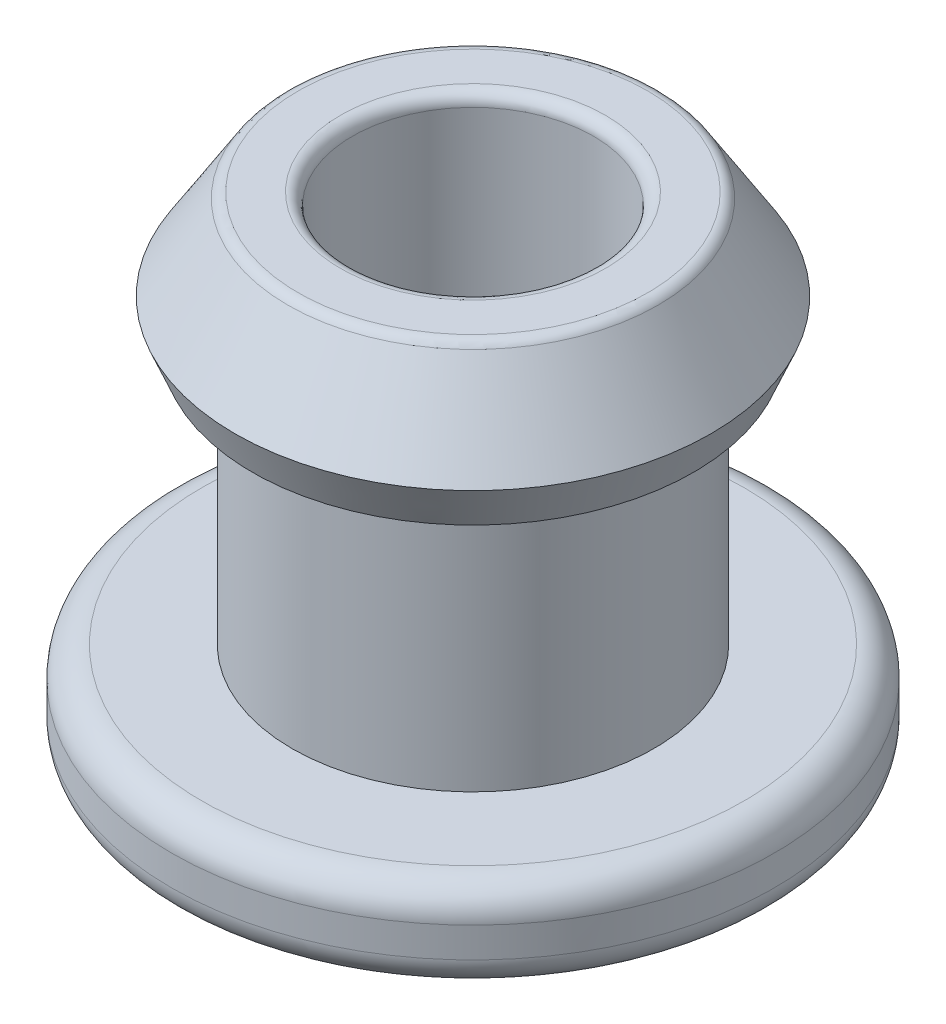
ISO-10303-21;
HEADER;
FILE_DESCRIPTION(('STEP AP214'),'2;1');
FILE_NAME('part.step','',(''),(''),'','','');
FILE_SCHEMA(('AUTOMOTIVE_DESIGN { 1 0 10303 214 1 1 1 1 }'));
ENDSEC;
DATA;
#1=APPLICATION_CONTEXT('core data for automotive mechanical design processes');
#2=APPLICATION_PROTOCOL_DEFINITION('international standard','automotive_design',2000,#1);
#3=PRODUCT_CONTEXT('',#1,'mechanical');
#4=PRODUCT('Part','Part','',(#3));
#5=PRODUCT_RELATED_PRODUCT_CATEGORY('part','',(#4));
#6=PRODUCT_DEFINITION_FORMATION('','',#4);
#7=PRODUCT_DEFINITION_CONTEXT('part definition',#1,'design');
#8=PRODUCT_DEFINITION('design','',#6,#7);
#9=PRODUCT_DEFINITION_SHAPE('','',#8);
#10=(LENGTH_UNIT() NAMED_UNIT(*) SI_UNIT(.MILLI.,.METRE.));
#11=(NAMED_UNIT(*) PLANE_ANGLE_UNIT() SI_UNIT($,.RADIAN.));
#12=(NAMED_UNIT(*) SI_UNIT($,.STERADIAN.) SOLID_ANGLE_UNIT());
#13=UNCERTAINTY_MEASURE_WITH_UNIT(LENGTH_MEASURE(1.E-05),#10,'distance_accuracy_value','');
#14=(GEOMETRIC_REPRESENTATION_CONTEXT(3) GLOBAL_UNCERTAINTY_ASSIGNED_CONTEXT((#13)) GLOBAL_UNIT_ASSIGNED_CONTEXT((#10,
#11,#12)) REPRESENTATION_CONTEXT('',''));
#15=CARTESIAN_POINT('',(0.,0.,0.));
#16=DIRECTION('',(0.,0.,1.));
#17=DIRECTION('',(1.,0.,0.));
#18=AXIS2_PLACEMENT_3D('',#15,#16,#17);
#19=CARTESIAN_POINT('',(3.01113884840841,8.,0.));
#20=DIRECTION('',(0.,1.,0.));
#21=DIRECTION('',(1.,0.,0.));
#22=AXIS2_PLACEMENT_3D('',#19,#20,#21);
#23=PLANE('',#22);
#24=CARTESIAN_POINT('',(0.,8.,0.));
#25=DIRECTION('',(0.,-1.,0.));
#26=DIRECTION('',(0.,0.,1.));
#27=AXIS2_PLACEMENT_3D('',#24,#25,#26);
#28=CIRCLE('',#27,2.2);
#29=CARTESIAN_POINT('',(0.,8.,-2.2));
#30=VERTEX_POINT('',#29);
#31=EDGE_CURVE('E21',#30,#30,#28,.T.);
#32=ORIENTED_EDGE('',*,*,#31,.T.);
#33=EDGE_LOOP('',(#32));
#34=FACE_BOUND('',#33,.T.);
#35=CARTESIAN_POINT('',(0.,8.,0.));
#36=DIRECTION('',(0.,1.,0.));
#37=DIRECTION('',(0.,0.,1.));
#38=AXIS2_PLACEMENT_3D('',#35,#36,#37);
#39=CIRCLE('',#38,2.90037456894001);
#40=CARTESIAN_POINT('',(0.,8.,-2.90037456894001));
#41=VERTEX_POINT('',#40);
#42=EDGE_CURVE('E138',#41,#41,#39,.T.);
#43=ORIENTED_EDGE('',*,*,#42,.T.);
#44=EDGE_LOOP('',(#43));
#45=FACE_BOUND('',#44,.T.);
#46=ADVANCED_FACE('F17',(#34,#45),#23,.T.);
#47=CARTESIAN_POINT('',(3.,5.8,0.));
#48=DIRECTION('',(0.,-1.,0.));
#49=DIRECTION('',(0.,0.,-1.));
#50=AXIS2_PLACEMENT_3D('',#47,#48,#49);
#51=PLANE('',#50);
#52=CARTESIAN_POINT('',(0.,5.8,0.));
#53=DIRECTION('',(0.,-1.,0.));
#54=DIRECTION('',(0.,0.,-1.));
#55=AXIS2_PLACEMENT_3D('',#52,#53,#54);
#56=CIRCLE('',#55,3.);
#57=CARTESIAN_POINT('',(0.,5.8,3.));
#58=VERTEX_POINT('',#57);
#59=EDGE_CURVE('E28',#58,#58,#56,.T.);
#60=ORIENTED_EDGE('',*,*,#59,.F.);
#61=EDGE_LOOP('',(#60));
#62=FACE_BOUND('',#61,.T.);
#63=CARTESIAN_POINT('',(0.,5.8,0.));
#64=DIRECTION('',(0.,-1.,0.));
#65=DIRECTION('',(0.,0.,-1.));
#66=AXIS2_PLACEMENT_3D('',#63,#64,#65);
#67=CIRCLE('',#66,3.66005050633884);
#68=CARTESIAN_POINT('',(0.,5.8,-3.66005050633884));
#69=VERTEX_POINT('',#68);
#70=EDGE_CURVE('E128',#69,#69,#67,.T.);
#71=ORIENTED_EDGE('',*,*,#70,.T.);
#72=EDGE_LOOP('',(#71));
#73=FACE_BOUND('',#72,.T.);
#74=ADVANCED_FACE('F214',(#62,#73),#51,.T.);
#75=CARTESIAN_POINT('',(5.,1.5,0.));
#76=DIRECTION('',(0.,1.,0.));
#77=DIRECTION('',(1.,0.,0.));
#78=AXIS2_PLACEMENT_3D('',#75,#76,#77);
#79=PLANE('',#78);
#80=CARTESIAN_POINT('',(0.,1.5,0.));
#81=DIRECTION('',(0.,-1.,0.));
#82=DIRECTION('',(0.,0.,-1.));
#83=AXIS2_PLACEMENT_3D('',#80,#81,#82);
#84=CIRCLE('',#83,3.);
#85=CARTESIAN_POINT('',(0.,1.5,3.));
#86=VERTEX_POINT('',#85);
#87=EDGE_CURVE('E123',#86,#86,#84,.T.);
#88=ORIENTED_EDGE('',*,*,#87,.T.);
#89=EDGE_LOOP('',(#88));
#90=FACE_BOUND('',#89,.T.);
#91=CARTESIAN_POINT('',(0.,1.5,0.));
#92=DIRECTION('',(0.,1.,0.));
#93=DIRECTION('',(0.,0.,1.));
#94=AXIS2_PLACEMENT_3D('',#91,#92,#93);
#95=CIRCLE('',#94,4.5);
#96=CARTESIAN_POINT('',(0.,1.5,-4.5));
#97=VERTEX_POINT('',#96);
#98=EDGE_CURVE('E117',#97,#97,#95,.T.);
#99=ORIENTED_EDGE('',*,*,#98,.T.);
#100=EDGE_LOOP('',(#99));
#101=FACE_BOUND('',#100,.T.);
#102=ADVANCED_FACE('F204',(#90,#101),#79,.T.);
#103=CARTESIAN_POINT('',(2.,0.,0.));
#104=DIRECTION('',(0.,-1.,0.));
#105=DIRECTION('',(0.,0.,-1.));
#106=AXIS2_PLACEMENT_3D('',#103,#104,#105);
#107=PLANE('',#106);
#108=CARTESIAN_POINT('',(0.,0.,0.));
#109=DIRECTION('',(0.,1.,0.));
#110=DIRECTION('',(0.,0.,-1.));
#111=AXIS2_PLACEMENT_3D('',#108,#109,#110);
#112=CIRCLE('',#111,2.3);
#113=CARTESIAN_POINT('',(0.,0.,2.3));
#114=VERTEX_POINT('',#113);
#115=EDGE_CURVE('E133',#114,#114,#112,.T.);
#116=ORIENTED_EDGE('',*,*,#115,.T.);
#117=EDGE_LOOP('',(#116));
#118=FACE_BOUND('',#117,.T.);
#119=CARTESIAN_POINT('',(0.,0.,0.));
#120=DIRECTION('',(0.,-1.,0.));
#121=DIRECTION('',(0.,0.,-1.));
#122=AXIS2_PLACEMENT_3D('',#119,#120,#121);
#123=CIRCLE('',#122,4.5);
#124=CARTESIAN_POINT('',(0.,0.,4.5));
#125=VERTEX_POINT('',#124);
#126=EDGE_CURVE('E177',#125,#125,#123,.T.);
#127=ORIENTED_EDGE('',*,*,#126,.T.);
#128=EDGE_LOOP('',(#127));
#129=FACE_BOUND('',#128,.T.);
#130=ADVANCED_FACE('F202',(#118,#129),#107,.T.);
#131=CARTESIAN_POINT('',(0.,0.,0.));
#132=DIRECTION('',(0.,-1.,0.));
#133=DIRECTION('',(0.,0.,-1.));
#134=AXIS2_PLACEMENT_3D('',#131,#132,#133);
#135=CYLINDRICAL_SURFACE('',#134,5.);
#136=CARTESIAN_POINT('',(0.,0.5,0.));
#137=DIRECTION('',(0.,1.,0.));
#138=DIRECTION('',(0.,0.,-1.));
#139=AXIS2_PLACEMENT_3D('',#136,#137,#138);
#140=CIRCLE('',#139,5.);
#141=CARTESIAN_POINT('',(0.,0.5,5.));
#142=VERTEX_POINT('',#141);
#143=EDGE_CURVE('E102',#142,#142,#140,.T.);
#144=ORIENTED_EDGE('',*,*,#143,.T.);
#145=DIRECTION('',(0.,1.,0.));
#146=VECTOR('',#145,1.);
#147=CARTESIAN_POINT('',(0.,0.,5.));
#148=LINE('',#147,#146);
#149=CARTESIAN_POINT('',(0.,1.,5.));
#150=VERTEX_POINT('',#149);
#151=EDGE_CURVE('E11',#142,#150,#148,.T.);
#152=ORIENTED_EDGE('',*,*,#151,.T.);
#153=CARTESIAN_POINT('',(0.,1.,0.));
#154=DIRECTION('',(0.,-1.,0.));
#155=DIRECTION('',(0.,0.,1.));
#156=AXIS2_PLACEMENT_3D('',#153,#154,#155);
#157=CIRCLE('',#156,5.);
#158=CARTESIAN_POINT('',(0.,1.,-5.));
#159=VERTEX_POINT('',#158);
#160=EDGE_CURVE('E99',#150,#159,#157,.T.);
#161=ORIENTED_EDGE('',*,*,#160,.T.);
#162=CARTESIAN_POINT('',(0.,1.,0.));
#163=DIRECTION('',(0.,-1.,0.));
#164=DIRECTION('',(0.,0.,1.));
#165=AXIS2_PLACEMENT_3D('',#162,#163,#164);
#166=CIRCLE('',#165,5.);
#167=EDGE_CURVE('E103',#159,#150,#166,.T.);
#168=ORIENTED_EDGE('',*,*,#167,.T.);
#169=ORIENTED_EDGE('',*,*,#151,.F.);
#170=EDGE_LOOP('',(#144,#152,#161,#168,#169));
#171=FACE_BOUND('',#170,.T.);
#172=ADVANCED_FACE('F97',(#171),#135,.T.);
#173=CARTESIAN_POINT('',(0.,0.,0.));
#174=DIRECTION('',(0.,-1.,0.));
#175=DIRECTION('',(0.,0.,-1.));
#176=AXIS2_PLACEMENT_3D('',#173,#174,#175);
#177=CYLINDRICAL_SURFACE('',#176,3.);
#178=ORIENTED_EDGE('',*,*,#87,.F.);
#179=DIRECTION('',(0.,1.,0.));
#180=VECTOR('',#179,1.);
#181=CARTESIAN_POINT('',(0.,0.,3.));
#182=LINE('',#181,#180);
#183=EDGE_CURVE('E127',#86,#58,#182,.T.);
#184=ORIENTED_EDGE('',*,*,#183,.T.);
#185=ORIENTED_EDGE('',*,*,#59,.T.);
#186=ORIENTED_EDGE('',*,*,#183,.F.);
#187=EDGE_LOOP('',(#178,#184,#185,#186));
#188=FACE_BOUND('',#187,.T.);
#189=ADVANCED_FACE('F212',(#188),#177,.T.);
#190=CARTESIAN_POINT('',(0.,5.8,0.));
#191=DIRECTION('',(0.,1.,0.));
#192=DIRECTION('',(0.,0.,1.));
#193=AXIS2_PLACEMENT_3D('',#190,#191,#192);
#194=CONICAL_SURFACE('',#193,3.66005050633884,0.392699081698718);
#195=CARTESIAN_POINT('',(0.,6.5,0.));
#196=DIRECTION('',(0.,-1.,0.));
#197=DIRECTION('',(0.,0.,-1.));
#198=AXIS2_PLACEMENT_3D('',#195,#196,#197);
#199=CIRCLE('',#198,3.95);
#200=CARTESIAN_POINT('',(0.,6.5,-3.95));
#201=VERTEX_POINT('',#200);
#202=CARTESIAN_POINT('',(0.,6.5,3.95));
#203=VERTEX_POINT('',#202);
#204=EDGE_CURVE('E189',#201,#203,#199,.T.);
#205=ORIENTED_EDGE('',*,*,#204,.T.);
#206=CARTESIAN_POINT('',(0.,6.5,0.));
#207=DIRECTION('',(0.,-1.,0.));
#208=DIRECTION('',(0.,0.,-1.));
#209=AXIS2_PLACEMENT_3D('',#206,#207,#208);
#210=CIRCLE('',#209,3.95);
#211=EDGE_CURVE('E185',#203,#201,#210,.T.);
#212=ORIENTED_EDGE('',*,*,#211,.T.);
#213=DIRECTION('',(0.,-0.923879532511289,0.382683432365084));
#214=VECTOR('',#213,1.);
#215=CARTESIAN_POINT('',(0.,5.8,-3.66005050633884));
#216=LINE('',#215,#214);
#217=EDGE_CURVE('E142',#201,#69,#216,.T.);
#218=ORIENTED_EDGE('',*,*,#217,.T.);
#219=ORIENTED_EDGE('',*,*,#70,.F.);
#220=ORIENTED_EDGE('',*,*,#217,.F.);
#221=EDGE_LOOP('',(#205,#212,#218,#219,#220));
#222=FACE_BOUND('',#221,.T.);
#223=ADVANCED_FACE('F236',(#222),#194,.T.);
#224=CARTESIAN_POINT('',(0.,6.5,0.));
#225=DIRECTION('',(0.,-1.,0.));
#226=DIRECTION('',(0.,0.,-1.));
#227=AXIS2_PLACEMENT_3D('',#224,#225,#226);
#228=CONICAL_SURFACE('',#227,3.95,0.559251586324235);
#229=ORIENTED_EDGE('',*,*,#204,.F.);
#230=ORIENTED_EDGE('',*,*,#211,.F.);
#231=DIRECTION('',(0.,0.847652420707666,-0.53055195190333));
#232=VECTOR('',#231,1.);
#233=CARTESIAN_POINT('',(0.,6.5,3.95));
#234=LINE('',#233,#232);
#235=CARTESIAN_POINT('',(0.,7.90611039038067,3.06990505308154));
#236=VERTEX_POINT('',#235);
#237=EDGE_CURVE('E173',#203,#236,#234,.T.);
#238=ORIENTED_EDGE('',*,*,#237,.T.);
#239=CARTESIAN_POINT('',(0.,7.90611039038067,0.));
#240=DIRECTION('',(0.,-1.,0.));
#241=DIRECTION('',(0.,0.,1.));
#242=AXIS2_PLACEMENT_3D('',#239,#240,#241);
#243=CIRCLE('',#242,3.06990505308154);
#244=CARTESIAN_POINT('',(0.,7.90611039038067,-3.06990505308154));
#245=VERTEX_POINT('',#244);
#246=EDGE_CURVE('E137',#236,#245,#243,.T.);
#247=ORIENTED_EDGE('',*,*,#246,.T.);
#248=CARTESIAN_POINT('',(0.,7.90611039038067,0.));
#249=DIRECTION('',(0.,-1.,0.));
#250=DIRECTION('',(0.,0.,1.));
#251=AXIS2_PLACEMENT_3D('',#248,#249,#250);
#252=CIRCLE('',#251,3.06990505308154);
#253=EDGE_CURVE('E156',#245,#236,#252,.T.);
#254=ORIENTED_EDGE('',*,*,#253,.T.);
#255=ORIENTED_EDGE('',*,*,#237,.F.);
#256=EDGE_LOOP('',(#229,#230,#238,#247,#254,#255));
#257=FACE_BOUND('',#256,.T.);
#258=ADVANCED_FACE('F19',(#257),#228,.T.);
#259=CARTESIAN_POINT('',(0.,0.,0.));
#260=DIRECTION('',(0.,-1.,0.));
#261=DIRECTION('',(0.,0.,-1.));
#262=AXIS2_PLACEMENT_3D('',#259,#260,#261);
#263=CYLINDRICAL_SURFACE('',#262,2.);
#264=CARTESIAN_POINT('',(0.,7.8,0.));
#265=DIRECTION('',(0.,1.,0.));
#266=DIRECTION('',(0.,0.,1.));
#267=AXIS2_PLACEMENT_3D('',#264,#265,#266);
#268=CIRCLE('',#267,2.);
#269=CARTESIAN_POINT('',(0.,7.8,2.));
#270=VERTEX_POINT('',#269);
#271=CARTESIAN_POINT('',(0.,7.8,-2.));
#272=VERTEX_POINT('',#271);
#273=EDGE_CURVE('E106',#270,#272,#268,.T.);
#274=ORIENTED_EDGE('',*,*,#273,.T.);
#275=CARTESIAN_POINT('',(0.,7.8,0.));
#276=DIRECTION('',(0.,1.,0.));
#277=DIRECTION('',(0.,0.,1.));
#278=AXIS2_PLACEMENT_3D('',#275,#276,#277);
#279=CIRCLE('',#278,2.);
#280=EDGE_CURVE('E152',#272,#270,#279,.T.);
#281=ORIENTED_EDGE('',*,*,#280,.T.);
#282=DIRECTION('',(0.,-1.,0.));
#283=VECTOR('',#282,1.);
#284=CARTESIAN_POINT('',(0.,0.,2.));
#285=LINE('',#284,#283);
#286=CARTESIAN_POINT('',(0.,0.412914576141351,2.));
#287=VERTEX_POINT('',#286);
#288=EDGE_CURVE('E164',#270,#287,#285,.T.);
#289=ORIENTED_EDGE('',*,*,#288,.T.);
#290=CARTESIAN_POINT('',(0.,0.412914576141351,0.));
#291=DIRECTION('',(0.,-1.,0.));
#292=DIRECTION('',(0.,0.,-1.));
#293=AXIS2_PLACEMENT_3D('',#290,#291,#292);
#294=CIRCLE('',#293,2.);
#295=EDGE_CURVE('E121',#287,#287,#294,.T.);
#296=ORIENTED_EDGE('',*,*,#295,.T.);
#297=ORIENTED_EDGE('',*,*,#288,.F.);
#298=EDGE_LOOP('',(#274,#281,#289,#296,#297));
#299=FACE_BOUND('',#298,.T.);
#300=ADVANCED_FACE('F231',(#299),#263,.F.);
#301=CARTESIAN_POINT('',(0.,7.8,0.));
#302=DIRECTION('',(0.,1.,0.));
#303=DIRECTION('',(0.,0.,1.));
#304=AXIS2_PLACEMENT_3D('',#301,#302,#303);
#305=TOROIDAL_SURFACE('',#304,2.90037456894001,0.2);
#306=ORIENTED_EDGE('',*,*,#42,.F.);
#307=CARTESIAN_POINT('',(0.,7.8,-2.90037456894001));
#308=DIRECTION('',(-1.,0.,0.));
#309=DIRECTION('',(0.,0.,-1.));
#310=AXIS2_PLACEMENT_3D('',#307,#308,#309);
#311=CIRCLE('',#310,0.2);
#312=EDGE_CURVE('E134',#41,#245,#311,.T.);
#313=ORIENTED_EDGE('',*,*,#312,.T.);
#314=ORIENTED_EDGE('',*,*,#246,.F.);
#315=ORIENTED_EDGE('',*,*,#253,.F.);
#316=ORIENTED_EDGE('',*,*,#312,.F.);
#317=EDGE_LOOP('',(#306,#313,#314,#315,#316));
#318=FACE_BOUND('',#317,.T.);
#319=ADVANCED_FACE('F234',(#318),#305,.T.);
#320=CARTESIAN_POINT('',(0.,7.8,0.));
#321=DIRECTION('',(0.,1.,0.));
#322=DIRECTION('',(0.,0.,1.));
#323=AXIS2_PLACEMENT_3D('',#320,#321,#322);
#324=TOROIDAL_SURFACE('',#323,2.2,0.2);
#325=ORIENTED_EDGE('',*,*,#273,.F.);
#326=ORIENTED_EDGE('',*,*,#280,.F.);
#327=CARTESIAN_POINT('',(0.,7.8,-2.2));
#328=DIRECTION('',(-1.,0.,0.));
#329=DIRECTION('',(0.,0.,-1.));
#330=AXIS2_PLACEMENT_3D('',#327,#328,#329);
#331=CIRCLE('',#330,0.2);
#332=EDGE_CURVE('E160',#272,#30,#331,.T.);
#333=ORIENTED_EDGE('',*,*,#332,.T.);
#334=ORIENTED_EDGE('',*,*,#31,.F.);
#335=ORIENTED_EDGE('',*,*,#332,.F.);
#336=EDGE_LOOP('',(#325,#326,#333,#334,#335));
#337=FACE_BOUND('',#336,.T.);
#338=ADVANCED_FACE('F242',(#337),#324,.T.);
#339=CARTESIAN_POINT('',(0.,1.,0.));
#340=DIRECTION('',(0.,1.,0.));
#341=DIRECTION('',(0.,0.,1.));
#342=AXIS2_PLACEMENT_3D('',#339,#340,#341);
#343=TOROIDAL_SURFACE('',#342,4.5,0.5);
#344=ORIENTED_EDGE('',*,*,#98,.F.);
#345=CARTESIAN_POINT('',(0.,1.,-4.5));
#346=DIRECTION('',(-1.,0.,0.));
#347=DIRECTION('',(0.,0.,-1.));
#348=AXIS2_PLACEMENT_3D('',#345,#346,#347);
#349=CIRCLE('',#348,0.5);
#350=EDGE_CURVE('E110',#97,#159,#349,.T.);
#351=ORIENTED_EDGE('',*,*,#350,.T.);
#352=ORIENTED_EDGE('',*,*,#160,.F.);
#353=ORIENTED_EDGE('',*,*,#167,.F.);
#354=ORIENTED_EDGE('',*,*,#350,.F.);
#355=EDGE_LOOP('',(#344,#351,#352,#353,#354));
#356=FACE_BOUND('',#355,.T.);
#357=ADVANCED_FACE('F109',(#356),#343,.T.);
#358=CARTESIAN_POINT('',(0.,0.5,0.));
#359=DIRECTION('',(0.,-1.,0.));
#360=DIRECTION('',(0.,0.,-1.));
#361=AXIS2_PLACEMENT_3D('',#358,#359,#360);
#362=TOROIDAL_SURFACE('',#361,4.5,0.5);
#363=ORIENTED_EDGE('',*,*,#126,.F.);
#364=CARTESIAN_POINT('',(0.,0.5,4.5));
#365=DIRECTION('',(-1.,0.,0.));
#366=DIRECTION('',(0.,0.,1.));
#367=AXIS2_PLACEMENT_3D('',#364,#365,#366);
#368=CIRCLE('',#367,0.5);
#369=EDGE_CURVE('E176',#125,#142,#368,.T.);
#370=ORIENTED_EDGE('',*,*,#369,.T.);
#371=ORIENTED_EDGE('',*,*,#143,.F.);
#372=ORIENTED_EDGE('',*,*,#369,.F.);
#373=EDGE_LOOP('',(#363,#370,#371,#372));
#374=FACE_BOUND('',#373,.T.);
#375=ADVANCED_FACE('F200',(#374),#362,.T.);
#376=CARTESIAN_POINT('',(0.,0.412914576141351,0.));
#377=DIRECTION('',(0.,-1.,0.));
#378=DIRECTION('',(0.,0.,-1.));
#379=AXIS2_PLACEMENT_3D('',#376,#377,#378);
#380=CONICAL_SURFACE('',#379,2.,0.628318530717962);
#381=ORIENTED_EDGE('',*,*,#295,.F.);
#382=DIRECTION('',(0.,-0.809016994374946,0.587785252292476));
#383=VECTOR('',#382,1.);
#384=CARTESIAN_POINT('',(0.,0.412914576141351,2.));
#385=LINE('',#384,#383);
#386=EDGE_CURVE('E129',#287,#114,#385,.T.);
#387=ORIENTED_EDGE('',*,*,#386,.T.);
#388=ORIENTED_EDGE('',*,*,#115,.F.);
#389=ORIENTED_EDGE('',*,*,#386,.F.);
#390=EDGE_LOOP('',(#381,#387,#388,#389));
#391=FACE_BOUND('',#390,.T.);
#392=ADVANCED_FACE('F245',(#391),#380,.F.);
#393=CLOSED_SHELL('',(#46,#74,#102,#130,#172,#189,#223,#258,#300,#319,#338,#357,#375,#392));
#394=MANIFOLD_SOLID_BREP('B1',#393);
#395=ADVANCED_BREP_SHAPE_REPRESENTATION('',(#18,#394),#14);
#396=SHAPE_DEFINITION_REPRESENTATION(#9,#395);
ENDSEC;
END-ISO-10303-21;
